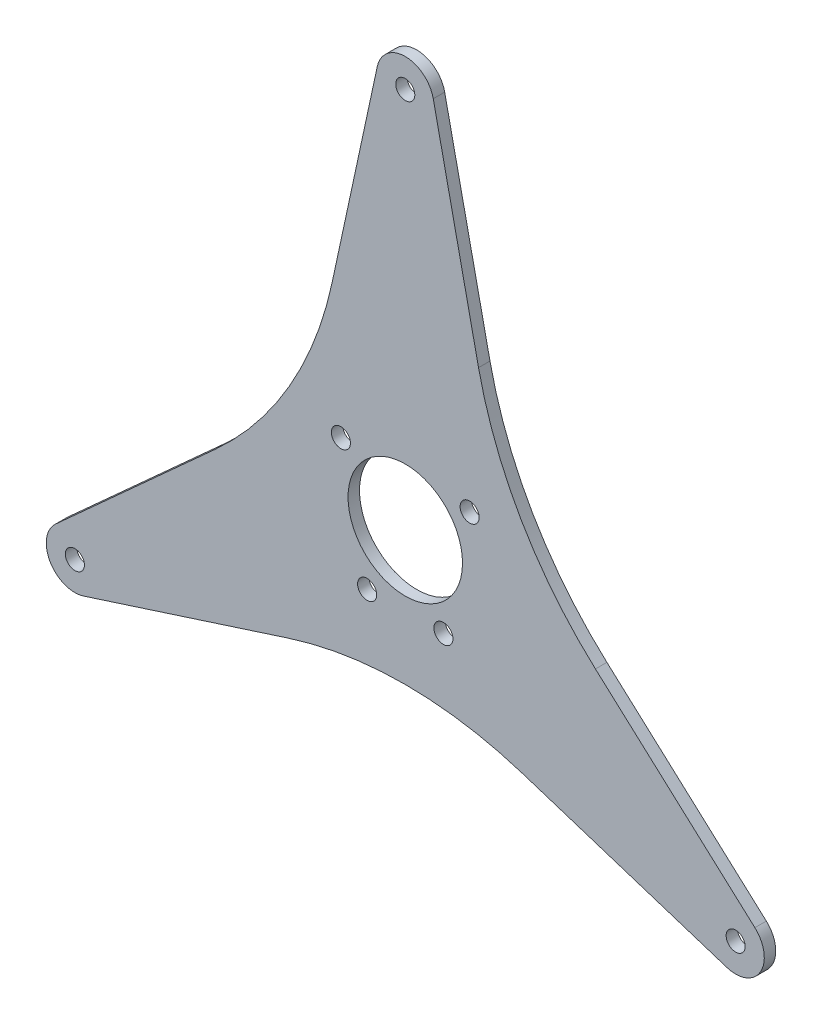
ISO-10303-21;
HEADER;
FILE_DESCRIPTION(('STEP AP214'),'2;1');
FILE_NAME('part.step','',(''),(''),'','','');
FILE_SCHEMA(('AUTOMOTIVE_DESIGN { 1 0 10303 214 1 1 1 1 }'));
ENDSEC;
DATA;
#1=APPLICATION_CONTEXT('core data for automotive mechanical design processes');
#2=APPLICATION_PROTOCOL_DEFINITION('international standard','automotive_design',2000,#1);
#3=PRODUCT_CONTEXT('',#1,'mechanical');
#4=PRODUCT('Part','Part','',(#3));
#5=PRODUCT_RELATED_PRODUCT_CATEGORY('part','',(#4));
#6=PRODUCT_DEFINITION_FORMATION('','',#4);
#7=PRODUCT_DEFINITION_CONTEXT('part definition',#1,'design');
#8=PRODUCT_DEFINITION('design','',#6,#7);
#9=PRODUCT_DEFINITION_SHAPE('','',#8);
#10=(LENGTH_UNIT() NAMED_UNIT(*) SI_UNIT(.MILLI.,.METRE.));
#11=(NAMED_UNIT(*) PLANE_ANGLE_UNIT() SI_UNIT($,.RADIAN.));
#12=(NAMED_UNIT(*) SI_UNIT($,.STERADIAN.) SOLID_ANGLE_UNIT());
#13=UNCERTAINTY_MEASURE_WITH_UNIT(LENGTH_MEASURE(1.E-05),#10,'distance_accuracy_value','');
#14=(GEOMETRIC_REPRESENTATION_CONTEXT(3) GLOBAL_UNCERTAINTY_ASSIGNED_CONTEXT((#13)) GLOBAL_UNIT_ASSIGNED_CONTEXT((#10,
#11,#12)) REPRESENTATION_CONTEXT('',''));
#15=CARTESIAN_POINT('',(0.,0.,0.));
#16=DIRECTION('',(0.,0.,1.));
#17=DIRECTION('',(1.,0.,0.));
#18=AXIS2_PLACEMENT_3D('',#15,#16,#17);
#19=CARTESIAN_POINT('',(-173.205080756888,-100.,6.));
#20=DIRECTION('',(0.,0.,1.));
#21=DIRECTION('',(1.,0.,0.));
#22=AXIS2_PLACEMENT_3D('',#19,#20,#21);
#23=PLANE('',#22);
#24=CARTESIAN_POINT('',(-20.,-36.9323706252388,6.));
#25=DIRECTION('',(0.,0.,1.));
#26=DIRECTION('',(1.,0.,0.));
#27=AXIS2_PLACEMENT_3D('',#24,#25,#26);
#28=CIRCLE('',#27,5.);
#29=CARTESIAN_POINT('',(-15.,-36.9323706252388,6.));
#30=VERTEX_POINT('',#29);
#31=EDGE_CURVE('E309',#30,#30,#28,.T.);
#32=ORIENTED_EDGE('',*,*,#31,.F.);
#33=EDGE_LOOP('',(#32));
#34=FACE_BOUND('',#33,.T.);
#35=CARTESIAN_POINT('',(-33.75,25.0610766091262,6.));
#36=DIRECTION('',(0.,0.,1.));
#37=DIRECTION('',(1.,0.,0.));
#38=AXIS2_PLACEMENT_3D('',#35,#36,#37);
#39=CIRCLE('',#38,5.);
#40=CARTESIAN_POINT('',(-28.75,25.0610766091262,6.));
#41=VERTEX_POINT('',#40);
#42=EDGE_CURVE('E321',#41,#41,#39,.T.);
#43=ORIENTED_EDGE('',*,*,#42,.F.);
#44=EDGE_LOOP('',(#43));
#45=FACE_BOUND('',#44,.T.);
#46=CARTESIAN_POINT('',(173.205080756888,-100.,6.));
#47=DIRECTION('',(0.,0.,1.));
#48=DIRECTION('',(1.,0.,0.));
#49=AXIS2_PLACEMENT_3D('',#46,#47,#48);
#50=CIRCLE('',#49,4.99999999999999);
#51=CARTESIAN_POINT('',(178.205080756888,-100.,6.));
#52=VERTEX_POINT('',#51);
#53=EDGE_CURVE('E333',#52,#52,#50,.T.);
#54=ORIENTED_EDGE('',*,*,#53,.F.);
#55=EDGE_LOOP('',(#54));
#56=FACE_BOUND('',#55,.T.);
#57=CARTESIAN_POINT('',(0.,200.,6.));
#58=DIRECTION('',(0.,0.,1.));
#59=DIRECTION('',(1.,0.,0.));
#60=AXIS2_PLACEMENT_3D('',#57,#58,#59);
#61=CIRCLE('',#60,5.00000000000001);
#62=CARTESIAN_POINT('',(5.0000000000001,200.,6.));
#63=VERTEX_POINT('',#62);
#64=EDGE_CURVE('E160',#63,#63,#61,.T.);
#65=ORIENTED_EDGE('',*,*,#64,.F.);
#66=EDGE_LOOP('',(#65));
#67=FACE_BOUND('',#66,.T.);
#68=CARTESIAN_POINT('',(-173.205080756888,-100.,6.));
#69=DIRECTION('',(0.,0.,1.));
#70=DIRECTION('',(1.,0.,0.));
#71=AXIS2_PLACEMENT_3D('',#68,#69,#70);
#72=CIRCLE('',#71,15.);
#73=CARTESIAN_POINT('',(-183.272280018508,-88.880130440206,6.));
#74=VERTEX_POINT('',#73);
#75=CARTESIAN_POINT('',(-168.608590862147,-114.27838508542,6.));
#76=VERTEX_POINT('',#75);
#77=EDGE_CURVE('E179',#74,#76,#72,.T.);
#78=ORIENTED_EDGE('',*,*,#77,.T.);
#79=DIRECTION('',(0.951892339028003,0.306432659649388,0.));
#80=VECTOR('',#79,1.);
#81=CARTESIAN_POINT('',(-168.608590862147,-114.27838508542,6.));
#82=LINE('',#81,#80);
#83=CARTESIAN_POINT('',(-61.2865319298776,-79.7293267420728,6.));
#84=VERTEX_POINT('',#83);
#85=EDGE_CURVE('E107',#76,#84,#82,.T.);
#86=ORIENTED_EDGE('',*,*,#85,.T.);
#87=CARTESIAN_POINT('',(0.,-270.107794547674,6.));
#88=DIRECTION('',(0.,0.,-1.));
#89=DIRECTION('',(-1.,0.,0.));
#90=AXIS2_PLACEMENT_3D('',#87,#88,#89);
#91=CIRCLE('',#90,200.);
#92=CARTESIAN_POINT('',(61.2865319298776,-79.7293267420729,6.));
#93=VERTEX_POINT('',#92);
#94=EDGE_CURVE('E206',#84,#93,#91,.T.);
#95=ORIENTED_EDGE('',*,*,#94,.T.);
#96=DIRECTION('',(0.951892339028003,-0.306432659649388,0.));
#97=VECTOR('',#96,1.);
#98=CARTESIAN_POINT('',(61.2865319298776,-79.7293267420729,6.));
#99=LINE('',#98,#97);
#100=CARTESIAN_POINT('',(168.608590862147,-114.27838508542,6.));
#101=VERTEX_POINT('',#100);
#102=EDGE_CURVE('E225',#93,#101,#99,.T.);
#103=ORIENTED_EDGE('',*,*,#102,.T.);
#104=CARTESIAN_POINT('',(173.205080756888,-100.,6.));
#105=DIRECTION('',(0.,0.,1.));
#106=DIRECTION('',(1.,0.,0.));
#107=AXIS2_PLACEMENT_3D('',#104,#105,#106);
#108=CIRCLE('',#107,15.);
#109=CARTESIAN_POINT('',(183.272280018508,-88.880130440206,6.));
#110=VERTEX_POINT('',#109);
#111=EDGE_CURVE('E222',#101,#110,#108,.T.);
#112=ORIENTED_EDGE('',*,*,#111,.T.);
#113=DIRECTION('',(-0.741324637319602,0.671146617441346,0.));
#114=VECTOR('',#113,1.);
#115=CARTESIAN_POINT('',(99.690888350204,-13.2110301900838,6.));
#116=LINE('',#115,#114);
#117=CARTESIAN_POINT('',(99.690888350204,-13.2110301900837,6.));
#118=VERTEX_POINT('',#117);
#119=EDGE_CURVE('E224',#110,#118,#116,.T.);
#120=ORIENTED_EDGE('',*,*,#119,.T.);
#121=CARTESIAN_POINT('',(233.920211838473,135.053897273837,6.));
#122=DIRECTION('',(0.,0.,-1.));
#123=DIRECTION('',(1.,0.,0.));
#124=AXIS2_PLACEMENT_3D('',#121,#122,#123);
#125=CIRCLE('',#124,200.);
#126=CARTESIAN_POINT('',(38.4043564203265,92.9403569321565,6.));
#127=VERTEX_POINT('',#126);
#128=EDGE_CURVE('E227',#118,#127,#125,.T.);
#129=ORIENTED_EDGE('',*,*,#128,.T.);
#130=DIRECTION('',(-0.210567701708401,0.977579277090734,0.));
#131=VECTOR('',#130,1.);
#132=CARTESIAN_POINT('',(14.6636891563611,203.158515525626,6.));
#133=LINE('',#132,#131);
#134=CARTESIAN_POINT('',(14.6636891563612,203.158515525626,6.));
#135=VERTEX_POINT('',#134);
#136=EDGE_CURVE('E233',#127,#135,#133,.T.);
#137=ORIENTED_EDGE('',*,*,#136,.T.);
#138=CARTESIAN_POINT('',(0.,200.,6.));
#139=DIRECTION('',(0.,0.,1.));
#140=DIRECTION('',(1.,0.,0.));
#141=AXIS2_PLACEMENT_3D('',#138,#139,#140);
#142=CIRCLE('',#141,15.0000000000001);
#143=CARTESIAN_POINT('',(-14.6636891563611,203.158515525626,6.));
#144=VERTEX_POINT('',#143);
#145=EDGE_CURVE('E138',#135,#144,#142,.T.);
#146=ORIENTED_EDGE('',*,*,#145,.T.);
#147=DIRECTION('',(-0.210567701708401,-0.977579277090734,0.));
#148=VECTOR('',#147,1.);
#149=CARTESIAN_POINT('',(-38.4043564203265,92.9403569321565,6.));
#150=LINE('',#149,#148);
#151=CARTESIAN_POINT('',(-38.4043564203265,92.9403569321564,6.));
#152=VERTEX_POINT('',#151);
#153=EDGE_CURVE('E132',#144,#152,#150,.T.);
#154=ORIENTED_EDGE('',*,*,#153,.T.);
#155=CARTESIAN_POINT('',(-233.920211838473,135.053897273837,6.));
#156=DIRECTION('',(0.,0.,-1.));
#157=DIRECTION('',(1.,0.,0.));
#158=AXIS2_PLACEMENT_3D('',#155,#156,#157);
#159=CIRCLE('',#158,200.);
#160=CARTESIAN_POINT('',(-99.690888350204,-13.2110301900838,6.));
#161=VERTEX_POINT('',#160);
#162=EDGE_CURVE('E136',#152,#161,#159,.T.);
#163=ORIENTED_EDGE('',*,*,#162,.T.);
#164=DIRECTION('',(-0.741324637319602,-0.671146617441346,0.));
#165=VECTOR('',#164,1.);
#166=CARTESIAN_POINT('',(-183.272280018508,-88.880130440206,6.));
#167=LINE('',#166,#165);
#168=EDGE_CURVE('E52',#161,#74,#167,.T.);
#169=ORIENTED_EDGE('',*,*,#168,.T.);
#170=EDGE_LOOP('',(#78,#86,#95,#103,#112,#120,#129,#137,#146,#154,#163,#169));
#171=FACE_BOUND('',#170,.T.);
#172=CARTESIAN_POINT('',(0.,0.,6.));
#173=DIRECTION('',(0.,0.,1.));
#174=DIRECTION('',(1.,0.,0.));
#175=AXIS2_PLACEMENT_3D('',#172,#173,#174);
#176=CIRCLE('',#175,30.);
#177=CARTESIAN_POINT('',(30.,0.,6.));
#178=VERTEX_POINT('',#177);
#179=EDGE_CURVE('E339',#178,#178,#176,.T.);
#180=ORIENTED_EDGE('',*,*,#179,.F.);
#181=EDGE_LOOP('',(#180));
#182=FACE_BOUND('',#181,.T.);
#183=CARTESIAN_POINT('',(-173.205080756888,-100.,6.));
#184=DIRECTION('',(0.,0.,1.));
#185=DIRECTION('',(1.,0.,0.));
#186=AXIS2_PLACEMENT_3D('',#183,#184,#185);
#187=CIRCLE('',#186,5.00000000000002);
#188=CARTESIAN_POINT('',(-168.205080756888,-100.,6.));
#189=VERTEX_POINT('',#188);
#190=EDGE_CURVE('E327',#189,#189,#187,.T.);
#191=ORIENTED_EDGE('',*,*,#190,.F.);
#192=EDGE_LOOP('',(#191));
#193=FACE_BOUND('',#192,.T.);
#194=CARTESIAN_POINT('',(33.75,25.0610766091262,6.));
#195=DIRECTION('',(0.,0.,1.));
#196=DIRECTION('',(1.,0.,0.));
#197=AXIS2_PLACEMENT_3D('',#194,#195,#196);
#198=CIRCLE('',#197,4.99999999999999);
#199=CARTESIAN_POINT('',(38.75,25.0610766091262,6.));
#200=VERTEX_POINT('',#199);
#201=EDGE_CURVE('E315',#200,#200,#198,.T.);
#202=ORIENTED_EDGE('',*,*,#201,.F.);
#203=EDGE_LOOP('',(#202));
#204=FACE_BOUND('',#203,.T.);
#205=CARTESIAN_POINT('',(20.,-36.9323706252388,6.));
#206=DIRECTION('',(0.,0.,1.));
#207=DIRECTION('',(1.,0.,0.));
#208=AXIS2_PLACEMENT_3D('',#205,#206,#207);
#209=CIRCLE('',#208,5.);
#210=CARTESIAN_POINT('',(25.,-36.9323706252388,6.));
#211=VERTEX_POINT('',#210);
#212=EDGE_CURVE('E300',#211,#211,#209,.T.);
#213=ORIENTED_EDGE('',*,*,#212,.F.);
#214=EDGE_LOOP('',(#213));
#215=FACE_BOUND('',#214,.T.);
#216=ADVANCED_FACE('F35',(#34,#45,#56,#67,#171,#182,#193,#204,#215),#23,.T.);
#217=CARTESIAN_POINT('',(-173.205080756888,-100.,0.));
#218=DIRECTION('',(0.,0.,1.));
#219=DIRECTION('',(1.,0.,0.));
#220=AXIS2_PLACEMENT_3D('',#217,#218,#219);
#221=PLANE('',#220);
#222=CARTESIAN_POINT('',(-173.205080756888,-100.,0.));
#223=DIRECTION('',(0.,0.,1.));
#224=DIRECTION('',(1.,0.,0.));
#225=AXIS2_PLACEMENT_3D('',#222,#223,#224);
#226=CIRCLE('',#225,15.);
#227=CARTESIAN_POINT('',(-183.272280018508,-88.880130440206,0.));
#228=VERTEX_POINT('',#227);
#229=CARTESIAN_POINT('',(-168.608590862147,-114.27838508542,0.));
#230=VERTEX_POINT('',#229);
#231=EDGE_CURVE('E156',#228,#230,#226,.T.);
#232=ORIENTED_EDGE('',*,*,#231,.F.);
#233=DIRECTION('',(-0.741324637319602,-0.671146617441346,0.));
#234=VECTOR('',#233,1.);
#235=CARTESIAN_POINT('',(-183.272280018508,-88.880130440206,0.));
#236=LINE('',#235,#234);
#237=CARTESIAN_POINT('',(-99.690888350204,-13.2110301900838,0.));
#238=VERTEX_POINT('',#237);
#239=EDGE_CURVE('E99',#238,#228,#236,.T.);
#240=ORIENTED_EDGE('',*,*,#239,.F.);
#241=CARTESIAN_POINT('',(-233.920211838473,135.053897273837,0.));
#242=DIRECTION('',(0.,0.,-1.));
#243=DIRECTION('',(1.,0.,0.));
#244=AXIS2_PLACEMENT_3D('',#241,#242,#243);
#245=CIRCLE('',#244,200.);
#246=CARTESIAN_POINT('',(-38.4043564203265,92.9403569321564,0.));
#247=VERTEX_POINT('',#246);
#248=EDGE_CURVE('E93',#247,#238,#245,.T.);
#249=ORIENTED_EDGE('',*,*,#248,.F.);
#250=DIRECTION('',(-0.210567701708401,-0.977579277090734,0.));
#251=VECTOR('',#250,1.);
#252=CARTESIAN_POINT('',(-38.4043564203265,92.9403569321565,0.));
#253=LINE('',#252,#251);
#254=CARTESIAN_POINT('',(-14.6636891563611,203.158515525626,0.));
#255=VERTEX_POINT('',#254);
#256=EDGE_CURVE('E146',#255,#247,#253,.T.);
#257=ORIENTED_EDGE('',*,*,#256,.F.);
#258=CARTESIAN_POINT('',(0.,200.,0.));
#259=DIRECTION('',(0.,0.,1.));
#260=DIRECTION('',(1.,0.,0.));
#261=AXIS2_PLACEMENT_3D('',#258,#259,#260);
#262=CIRCLE('',#261,15.0000000000001);
#263=CARTESIAN_POINT('',(14.6636891563612,203.158515525626,0.));
#264=VERTEX_POINT('',#263);
#265=EDGE_CURVE('E174',#264,#255,#262,.T.);
#266=ORIENTED_EDGE('',*,*,#265,.F.);
#267=DIRECTION('',(-0.210567701708401,0.977579277090734,0.));
#268=VECTOR('',#267,1.);
#269=CARTESIAN_POINT('',(14.6636891563611,203.158515525626,0.));
#270=LINE('',#269,#268);
#271=CARTESIAN_POINT('',(38.4043564203265,92.9403569321565,0.));
#272=VERTEX_POINT('',#271);
#273=EDGE_CURVE('E172',#272,#264,#270,.T.);
#274=ORIENTED_EDGE('',*,*,#273,.F.);
#275=CARTESIAN_POINT('',(233.920211838473,135.053897273837,0.));
#276=DIRECTION('',(0.,0.,-1.));
#277=DIRECTION('',(1.,0.,0.));
#278=AXIS2_PLACEMENT_3D('',#275,#276,#277);
#279=CIRCLE('',#278,200.);
#280=CARTESIAN_POINT('',(99.690888350204,-13.2110301900837,0.));
#281=VERTEX_POINT('',#280);
#282=EDGE_CURVE('E170',#281,#272,#279,.T.);
#283=ORIENTED_EDGE('',*,*,#282,.F.);
#284=DIRECTION('',(-0.741324637319602,0.671146617441346,0.));
#285=VECTOR('',#284,1.);
#286=CARTESIAN_POINT('',(99.690888350204,-13.2110301900838,0.));
#287=LINE('',#286,#285);
#288=CARTESIAN_POINT('',(183.272280018508,-88.880130440206,0.));
#289=VERTEX_POINT('',#288);
#290=EDGE_CURVE('E168',#289,#281,#287,.T.);
#291=ORIENTED_EDGE('',*,*,#290,.F.);
#292=CARTESIAN_POINT('',(173.205080756888,-100.,0.));
#293=DIRECTION('',(0.,0.,1.));
#294=DIRECTION('',(1.,0.,0.));
#295=AXIS2_PLACEMENT_3D('',#292,#293,#294);
#296=CIRCLE('',#295,15.);
#297=CARTESIAN_POINT('',(168.608590862147,-114.27838508542,0.));
#298=VERTEX_POINT('',#297);
#299=EDGE_CURVE('E166',#298,#289,#296,.T.);
#300=ORIENTED_EDGE('',*,*,#299,.F.);
#301=DIRECTION('',(0.951892339028003,-0.306432659649388,0.));
#302=VECTOR('',#301,1.);
#303=CARTESIAN_POINT('',(61.2865319298776,-79.7293267420729,0.));
#304=LINE('',#303,#302);
#305=CARTESIAN_POINT('',(61.2865319298776,-79.7293267420729,0.));
#306=VERTEX_POINT('',#305);
#307=EDGE_CURVE('E164',#306,#298,#304,.T.);
#308=ORIENTED_EDGE('',*,*,#307,.F.);
#309=CARTESIAN_POINT('',(0.,-270.107794547674,0.));
#310=DIRECTION('',(0.,0.,-1.));
#311=DIRECTION('',(-1.,0.,0.));
#312=AXIS2_PLACEMENT_3D('',#309,#310,#311);
#313=CIRCLE('',#312,200.);
#314=CARTESIAN_POINT('',(-61.2865319298776,-79.7293267420728,0.));
#315=VERTEX_POINT('',#314);
#316=EDGE_CURVE('E162',#315,#306,#313,.T.);
#317=ORIENTED_EDGE('',*,*,#316,.F.);
#318=DIRECTION('',(0.951892339028003,0.306432659649388,0.));
#319=VECTOR('',#318,1.);
#320=CARTESIAN_POINT('',(-168.608590862147,-114.27838508542,0.));
#321=LINE('',#320,#319);
#322=EDGE_CURVE('E159',#230,#315,#321,.T.);
#323=ORIENTED_EDGE('',*,*,#322,.F.);
#324=EDGE_LOOP('',(#232,#240,#249,#257,#266,#274,#283,#291,#300,#308,#317,#323));
#325=FACE_BOUND('',#324,.T.);
#326=CARTESIAN_POINT('',(0.,200.,0.));
#327=DIRECTION('',(0.,0.,1.));
#328=DIRECTION('',(1.,0.,0.));
#329=AXIS2_PLACEMENT_3D('',#326,#327,#328);
#330=CIRCLE('',#329,5.00000000000001);
#331=CARTESIAN_POINT('',(5.0000000000001,200.,0.));
#332=VERTEX_POINT('',#331);
#333=EDGE_CURVE('E342',#332,#332,#330,.T.);
#334=ORIENTED_EDGE('',*,*,#333,.T.);
#335=EDGE_LOOP('',(#334));
#336=FACE_BOUND('',#335,.T.);
#337=CARTESIAN_POINT('',(0.,0.,0.));
#338=DIRECTION('',(0.,0.,1.));
#339=DIRECTION('',(1.,0.,0.));
#340=AXIS2_PLACEMENT_3D('',#337,#338,#339);
#341=CIRCLE('',#340,30.);
#342=CARTESIAN_POINT('',(30.,0.,0.));
#343=VERTEX_POINT('',#342);
#344=EDGE_CURVE('E336',#343,#343,#341,.T.);
#345=ORIENTED_EDGE('',*,*,#344,.T.);
#346=EDGE_LOOP('',(#345));
#347=FACE_BOUND('',#346,.T.);
#348=CARTESIAN_POINT('',(173.205080756888,-100.,0.));
#349=DIRECTION('',(0.,0.,1.));
#350=DIRECTION('',(1.,0.,0.));
#351=AXIS2_PLACEMENT_3D('',#348,#349,#350);
#352=CIRCLE('',#351,4.99999999999999);
#353=CARTESIAN_POINT('',(178.205080756888,-100.,0.));
#354=VERTEX_POINT('',#353);
#355=EDGE_CURVE('E330',#354,#354,#352,.T.);
#356=ORIENTED_EDGE('',*,*,#355,.T.);
#357=EDGE_LOOP('',(#356));
#358=FACE_BOUND('',#357,.T.);
#359=CARTESIAN_POINT('',(-173.205080756888,-100.,0.));
#360=DIRECTION('',(0.,0.,1.));
#361=DIRECTION('',(1.,0.,0.));
#362=AXIS2_PLACEMENT_3D('',#359,#360,#361);
#363=CIRCLE('',#362,5.00000000000002);
#364=CARTESIAN_POINT('',(-168.205080756888,-100.,0.));
#365=VERTEX_POINT('',#364);
#366=EDGE_CURVE('E324',#365,#365,#363,.T.);
#367=ORIENTED_EDGE('',*,*,#366,.T.);
#368=EDGE_LOOP('',(#367));
#369=FACE_BOUND('',#368,.T.);
#370=CARTESIAN_POINT('',(-33.75,25.0610766091262,0.));
#371=DIRECTION('',(0.,0.,1.));
#372=DIRECTION('',(1.,0.,0.));
#373=AXIS2_PLACEMENT_3D('',#370,#371,#372);
#374=CIRCLE('',#373,5.);
#375=CARTESIAN_POINT('',(-28.75,25.0610766091262,0.));
#376=VERTEX_POINT('',#375);
#377=EDGE_CURVE('E318',#376,#376,#374,.T.);
#378=ORIENTED_EDGE('',*,*,#377,.T.);
#379=EDGE_LOOP('',(#378));
#380=FACE_BOUND('',#379,.T.);
#381=CARTESIAN_POINT('',(33.75,25.0610766091262,0.));
#382=DIRECTION('',(0.,0.,1.));
#383=DIRECTION('',(1.,0.,0.));
#384=AXIS2_PLACEMENT_3D('',#381,#382,#383);
#385=CIRCLE('',#384,4.99999999999999);
#386=CARTESIAN_POINT('',(38.75,25.0610766091262,0.));
#387=VERTEX_POINT('',#386);
#388=EDGE_CURVE('E312',#387,#387,#385,.T.);
#389=ORIENTED_EDGE('',*,*,#388,.T.);
#390=EDGE_LOOP('',(#389));
#391=FACE_BOUND('',#390,.T.);
#392=CARTESIAN_POINT('',(-20.,-36.9323706252388,0.));
#393=DIRECTION('',(0.,0.,1.));
#394=DIRECTION('',(1.,0.,0.));
#395=AXIS2_PLACEMENT_3D('',#392,#393,#394);
#396=CIRCLE('',#395,5.);
#397=CARTESIAN_POINT('',(-15.,-36.9323706252388,0.));
#398=VERTEX_POINT('',#397);
#399=EDGE_CURVE('E306',#398,#398,#396,.T.);
#400=ORIENTED_EDGE('',*,*,#399,.T.);
#401=EDGE_LOOP('',(#400));
#402=FACE_BOUND('',#401,.T.);
#403=CARTESIAN_POINT('',(20.,-36.9323706252388,0.));
#404=DIRECTION('',(0.,0.,1.));
#405=DIRECTION('',(1.,0.,0.));
#406=AXIS2_PLACEMENT_3D('',#403,#404,#405);
#407=CIRCLE('',#406,5.);
#408=CARTESIAN_POINT('',(25.,-36.9323706252388,0.));
#409=VERTEX_POINT('',#408);
#410=EDGE_CURVE('E303',#409,#409,#407,.T.);
#411=ORIENTED_EDGE('',*,*,#410,.T.);
#412=EDGE_LOOP('',(#411));
#413=FACE_BOUND('',#412,.T.);
#414=ADVANCED_FACE('F210',(#325,#336,#347,#358,#369,#380,#391,#402,#413),#221,.F.);
#415=CARTESIAN_POINT('',(-173.205080756888,-100.,6.));
#416=DIRECTION('',(0.,0.,-1.));
#417=DIRECTION('',(-1.,0.,0.));
#418=AXIS2_PLACEMENT_3D('',#415,#416,#417);
#419=CYLINDRICAL_SURFACE('',#418,15.);
#420=ORIENTED_EDGE('',*,*,#231,.T.);
#421=DIRECTION('',(0.,0.,-1.));
#422=VECTOR('',#421,1.);
#423=CARTESIAN_POINT('',(-168.608590862147,-114.27838508542,6.));
#424=LINE('',#423,#422);
#425=EDGE_CURVE('E11',#76,#230,#424,.T.);
#426=ORIENTED_EDGE('',*,*,#425,.F.);
#427=ORIENTED_EDGE('',*,*,#77,.F.);
#428=DIRECTION('',(0.,0.,-1.));
#429=VECTOR('',#428,1.);
#430=CARTESIAN_POINT('',(-183.272280018508,-88.880130440206,6.));
#431=LINE('',#430,#429);
#432=EDGE_CURVE('E152',#74,#228,#431,.T.);
#433=ORIENTED_EDGE('',*,*,#432,.T.);
#434=EDGE_LOOP('',(#420,#426,#427,#433));
#435=FACE_BOUND('',#434,.T.);
#436=ADVANCED_FACE('F37',(#435),#419,.T.);
#437=CARTESIAN_POINT('',(-168.608590862147,-114.27838508542,6.));
#438=DIRECTION('',(-0.306432659649388,0.951892339028003,0.));
#439=DIRECTION('',(-0.951892339028003,-0.306432659649388,0.));
#440=AXIS2_PLACEMENT_3D('',#437,#438,#439);
#441=PLANE('',#440);
#442=ORIENTED_EDGE('',*,*,#322,.T.);
#443=DIRECTION('',(0.,0.,-1.));
#444=VECTOR('',#443,1.);
#445=CARTESIAN_POINT('',(-61.2865319298776,-79.7293267420728,6.));
#446=LINE('',#445,#444);
#447=EDGE_CURVE('E44',#84,#315,#446,.T.);
#448=ORIENTED_EDGE('',*,*,#447,.F.);
#449=ORIENTED_EDGE('',*,*,#85,.F.);
#450=ORIENTED_EDGE('',*,*,#425,.T.);
#451=EDGE_LOOP('',(#442,#448,#449,#450));
#452=FACE_BOUND('',#451,.T.);
#453=ADVANCED_FACE('F488',(#452),#441,.F.);
#454=CARTESIAN_POINT('',(0.,-270.107794547674,6.));
#455=DIRECTION('',(0.,0.,-1.));
#456=DIRECTION('',(-1.,0.,0.));
#457=AXIS2_PLACEMENT_3D('',#454,#455,#456);
#458=CYLINDRICAL_SURFACE('',#457,200.);
#459=ORIENTED_EDGE('',*,*,#316,.T.);
#460=DIRECTION('',(0.,0.,-1.));
#461=VECTOR('',#460,1.);
#462=CARTESIAN_POINT('',(61.2865319298776,-79.7293267420729,6.));
#463=LINE('',#462,#461);
#464=EDGE_CURVE('E198',#93,#306,#463,.T.);
#465=ORIENTED_EDGE('',*,*,#464,.F.);
#466=ORIENTED_EDGE('',*,*,#94,.F.);
#467=ORIENTED_EDGE('',*,*,#447,.T.);
#468=EDGE_LOOP('',(#459,#465,#466,#467));
#469=FACE_BOUND('',#468,.T.);
#470=ADVANCED_FACE('F204',(#469),#458,.F.);
#471=CARTESIAN_POINT('',(61.2865319298776,-79.7293267420729,6.));
#472=DIRECTION('',(0.306432659649388,0.951892339028003,0.));
#473=DIRECTION('',(-0.951892339028003,0.306432659649388,0.));
#474=AXIS2_PLACEMENT_3D('',#471,#472,#473);
#475=PLANE('',#474);
#476=ORIENTED_EDGE('',*,*,#307,.T.);
#477=DIRECTION('',(0.,0.,-1.));
#478=VECTOR('',#477,1.);
#479=CARTESIAN_POINT('',(168.608590862147,-114.27838508542,6.));
#480=LINE('',#479,#478);
#481=EDGE_CURVE('E195',#101,#298,#480,.T.);
#482=ORIENTED_EDGE('',*,*,#481,.F.);
#483=ORIENTED_EDGE('',*,*,#102,.F.);
#484=ORIENTED_EDGE('',*,*,#464,.T.);
#485=EDGE_LOOP('',(#476,#482,#483,#484));
#486=FACE_BOUND('',#485,.T.);
#487=ADVANCED_FACE('F216',(#486),#475,.F.);
#488=CARTESIAN_POINT('',(173.205080756888,-100.,6.));
#489=DIRECTION('',(0.,0.,-1.));
#490=DIRECTION('',(-1.,0.,0.));
#491=AXIS2_PLACEMENT_3D('',#488,#489,#490);
#492=CYLINDRICAL_SURFACE('',#491,15.);
#493=ORIENTED_EDGE('',*,*,#299,.T.);
#494=DIRECTION('',(0.,0.,-1.));
#495=VECTOR('',#494,1.);
#496=CARTESIAN_POINT('',(183.272280018508,-88.880130440206,6.));
#497=LINE('',#496,#495);
#498=EDGE_CURVE('E192',#110,#289,#497,.T.);
#499=ORIENTED_EDGE('',*,*,#498,.F.);
#500=ORIENTED_EDGE('',*,*,#111,.F.);
#501=ORIENTED_EDGE('',*,*,#481,.T.);
#502=EDGE_LOOP('',(#493,#499,#500,#501));
#503=FACE_BOUND('',#502,.T.);
#504=ADVANCED_FACE('F220',(#503),#492,.T.);
#505=CARTESIAN_POINT('',(99.690888350204,-13.2110301900838,6.));
#506=DIRECTION('',(-0.671146617441346,-0.741324637319602,0.));
#507=DIRECTION('',(0.741324637319602,-0.671146617441346,0.));
#508=AXIS2_PLACEMENT_3D('',#505,#506,#507);
#509=PLANE('',#508);
#510=ORIENTED_EDGE('',*,*,#290,.T.);
#511=DIRECTION('',(0.,0.,-1.));
#512=VECTOR('',#511,1.);
#513=CARTESIAN_POINT('',(99.690888350204,-13.2110301900837,6.));
#514=LINE('',#513,#512);
#515=EDGE_CURVE('E189',#118,#281,#514,.T.);
#516=ORIENTED_EDGE('',*,*,#515,.F.);
#517=ORIENTED_EDGE('',*,*,#119,.F.);
#518=ORIENTED_EDGE('',*,*,#498,.T.);
#519=EDGE_LOOP('',(#510,#516,#517,#518));
#520=FACE_BOUND('',#519,.T.);
#521=ADVANCED_FACE('F453',(#520),#509,.F.);
#522=CARTESIAN_POINT('',(233.920211838473,135.053897273837,6.));
#523=DIRECTION('',(0.,0.,-1.));
#524=DIRECTION('',(-1.,0.,0.));
#525=AXIS2_PLACEMENT_3D('',#522,#523,#524);
#526=CYLINDRICAL_SURFACE('',#525,200.);
#527=ORIENTED_EDGE('',*,*,#282,.T.);
#528=DIRECTION('',(0.,0.,-1.));
#529=VECTOR('',#528,1.);
#530=CARTESIAN_POINT('',(38.4043564203265,92.9403569321565,6.));
#531=LINE('',#530,#529);
#532=EDGE_CURVE('E186',#127,#272,#531,.T.);
#533=ORIENTED_EDGE('',*,*,#532,.F.);
#534=ORIENTED_EDGE('',*,*,#128,.F.);
#535=ORIENTED_EDGE('',*,*,#515,.T.);
#536=EDGE_LOOP('',(#527,#533,#534,#535));
#537=FACE_BOUND('',#536,.T.);
#538=ADVANCED_FACE('F444',(#537),#526,.F.);
#539=CARTESIAN_POINT('',(14.6636891563611,203.158515525626,6.));
#540=DIRECTION('',(-0.977579277090734,-0.210567701708401,0.));
#541=DIRECTION('',(0.210567701708401,-0.977579277090734,0.));
#542=AXIS2_PLACEMENT_3D('',#539,#540,#541);
#543=PLANE('',#542);
#544=ORIENTED_EDGE('',*,*,#273,.T.);
#545=DIRECTION('',(0.,0.,-1.));
#546=VECTOR('',#545,1.);
#547=CARTESIAN_POINT('',(14.6636891563612,203.158515525626,6.));
#548=LINE('',#547,#546);
#549=EDGE_CURVE('E183',#135,#264,#548,.T.);
#550=ORIENTED_EDGE('',*,*,#549,.F.);
#551=ORIENTED_EDGE('',*,*,#136,.F.);
#552=ORIENTED_EDGE('',*,*,#532,.T.);
#553=EDGE_LOOP('',(#544,#550,#551,#552));
#554=FACE_BOUND('',#553,.T.);
#555=ADVANCED_FACE('F239',(#554),#543,.F.);
#556=CARTESIAN_POINT('',(0.,200.,6.));
#557=DIRECTION('',(0.,0.,-1.));
#558=DIRECTION('',(-1.,0.,0.));
#559=AXIS2_PLACEMENT_3D('',#556,#557,#558);
#560=CYLINDRICAL_SURFACE('',#559,15.0000000000001);
#561=ORIENTED_EDGE('',*,*,#265,.T.);
#562=DIRECTION('',(0.,0.,-1.));
#563=VECTOR('',#562,1.);
#564=CARTESIAN_POINT('',(-14.6636891563611,203.158515525626,6.));
#565=LINE('',#564,#563);
#566=EDGE_CURVE('E147',#144,#255,#565,.T.);
#567=ORIENTED_EDGE('',*,*,#566,.F.);
#568=ORIENTED_EDGE('',*,*,#145,.F.);
#569=ORIENTED_EDGE('',*,*,#549,.T.);
#570=EDGE_LOOP('',(#561,#567,#568,#569));
#571=FACE_BOUND('',#570,.T.);
#572=ADVANCED_FACE('F243',(#571),#560,.T.);
#573=CARTESIAN_POINT('',(-38.4043564203265,92.9403569321565,6.));
#574=DIRECTION('',(0.977579277090734,-0.210567701708401,0.));
#575=DIRECTION('',(0.210567701708401,0.977579277090734,0.));
#576=AXIS2_PLACEMENT_3D('',#573,#574,#575);
#577=PLANE('',#576);
#578=ORIENTED_EDGE('',*,*,#256,.T.);
#579=DIRECTION('',(0.,0.,-1.));
#580=VECTOR('',#579,1.);
#581=CARTESIAN_POINT('',(-38.4043564203265,92.9403569321564,6.));
#582=LINE('',#581,#580);
#583=EDGE_CURVE('E143',#152,#247,#582,.T.);
#584=ORIENTED_EDGE('',*,*,#583,.F.);
#585=ORIENTED_EDGE('',*,*,#153,.F.);
#586=ORIENTED_EDGE('',*,*,#566,.T.);
#587=EDGE_LOOP('',(#578,#584,#585,#586));
#588=FACE_BOUND('',#587,.T.);
#589=ADVANCED_FACE('F144',(#588),#577,.F.);
#590=CARTESIAN_POINT('',(-233.920211838473,135.053897273837,6.));
#591=DIRECTION('',(0.,0.,-1.));
#592=DIRECTION('',(-1.,0.,0.));
#593=AXIS2_PLACEMENT_3D('',#590,#591,#592);
#594=CYLINDRICAL_SURFACE('',#593,200.);
#595=ORIENTED_EDGE('',*,*,#248,.T.);
#596=DIRECTION('',(0.,0.,-1.));
#597=VECTOR('',#596,1.);
#598=CARTESIAN_POINT('',(-99.690888350204,-13.2110301900838,6.));
#599=LINE('',#598,#597);
#600=EDGE_CURVE('E148',#161,#238,#599,.T.);
#601=ORIENTED_EDGE('',*,*,#600,.F.);
#602=ORIENTED_EDGE('',*,*,#162,.F.);
#603=ORIENTED_EDGE('',*,*,#583,.T.);
#604=EDGE_LOOP('',(#595,#601,#602,#603));
#605=FACE_BOUND('',#604,.T.);
#606=ADVANCED_FACE('F150',(#605),#594,.F.);
#607=CARTESIAN_POINT('',(-183.272280018508,-88.880130440206,6.));
#608=DIRECTION('',(0.671146617441346,-0.741324637319602,0.));
#609=DIRECTION('',(0.741324637319602,0.671146617441346,0.));
#610=AXIS2_PLACEMENT_3D('',#607,#608,#609);
#611=PLANE('',#610);
#612=ORIENTED_EDGE('',*,*,#239,.T.);
#613=ORIENTED_EDGE('',*,*,#432,.F.);
#614=ORIENTED_EDGE('',*,*,#168,.F.);
#615=ORIENTED_EDGE('',*,*,#600,.T.);
#616=EDGE_LOOP('',(#612,#613,#614,#615));
#617=FACE_BOUND('',#616,.T.);
#618=ADVANCED_FACE('F247',(#617),#611,.F.);
#619=CARTESIAN_POINT('',(0.,200.,6.));
#620=DIRECTION('',(0.,0.,-1.));
#621=DIRECTION('',(-1.,0.,0.));
#622=AXIS2_PLACEMENT_3D('',#619,#620,#621);
#623=CYLINDRICAL_SURFACE('',#622,5.00000000000001);
#624=ORIENTED_EDGE('',*,*,#64,.T.);
#625=EDGE_LOOP('',(#624));
#626=FACE_BOUND('',#625,.T.);
#627=ORIENTED_EDGE('',*,*,#333,.F.);
#628=EDGE_LOOP('',(#627));
#629=FACE_BOUND('',#628,.T.);
#630=ADVANCED_FACE('F249',(#626,#629),#623,.F.);
#631=CARTESIAN_POINT('',(0.,0.,6.));
#632=DIRECTION('',(0.,0.,-1.));
#633=DIRECTION('',(-1.,0.,0.));
#634=AXIS2_PLACEMENT_3D('',#631,#632,#633);
#635=CYLINDRICAL_SURFACE('',#634,30.);
#636=ORIENTED_EDGE('',*,*,#179,.T.);
#637=EDGE_LOOP('',(#636));
#638=FACE_BOUND('',#637,.T.);
#639=ORIENTED_EDGE('',*,*,#344,.F.);
#640=EDGE_LOOP('',(#639));
#641=FACE_BOUND('',#640,.T.);
#642=ADVANCED_FACE('F255',(#638,#641),#635,.F.);
#643=CARTESIAN_POINT('',(173.205080756888,-100.,6.));
#644=DIRECTION('',(0.,0.,-1.));
#645=DIRECTION('',(-1.,0.,0.));
#646=AXIS2_PLACEMENT_3D('',#643,#644,#645);
#647=CYLINDRICAL_SURFACE('',#646,4.99999999999999);
#648=ORIENTED_EDGE('',*,*,#53,.T.);
#649=EDGE_LOOP('',(#648));
#650=FACE_BOUND('',#649,.T.);
#651=ORIENTED_EDGE('',*,*,#355,.F.);
#652=EDGE_LOOP('',(#651));
#653=FACE_BOUND('',#652,.T.);
#654=ADVANCED_FACE('F271',(#650,#653),#647,.F.);
#655=CARTESIAN_POINT('',(-173.205080756888,-100.,6.));
#656=DIRECTION('',(0.,0.,-1.));
#657=DIRECTION('',(-1.,0.,0.));
#658=AXIS2_PLACEMENT_3D('',#655,#656,#657);
#659=CYLINDRICAL_SURFACE('',#658,5.00000000000002);
#660=ORIENTED_EDGE('',*,*,#190,.T.);
#661=EDGE_LOOP('',(#660));
#662=FACE_BOUND('',#661,.T.);
#663=ORIENTED_EDGE('',*,*,#366,.F.);
#664=EDGE_LOOP('',(#663));
#665=FACE_BOUND('',#664,.T.);
#666=ADVANCED_FACE('F275',(#662,#665),#659,.F.);
#667=CARTESIAN_POINT('',(-33.75,25.0610766091262,6.));
#668=DIRECTION('',(0.,0.,-1.));
#669=DIRECTION('',(-1.,0.,0.));
#670=AXIS2_PLACEMENT_3D('',#667,#668,#669);
#671=CYLINDRICAL_SURFACE('',#670,5.);
#672=ORIENTED_EDGE('',*,*,#42,.T.);
#673=EDGE_LOOP('',(#672));
#674=FACE_BOUND('',#673,.T.);
#675=ORIENTED_EDGE('',*,*,#377,.F.);
#676=EDGE_LOOP('',(#675));
#677=FACE_BOUND('',#676,.T.);
#678=ADVANCED_FACE('F279',(#674,#677),#671,.F.);
#679=CARTESIAN_POINT('',(33.75,25.0610766091262,6.));
#680=DIRECTION('',(0.,0.,-1.));
#681=DIRECTION('',(-1.,0.,0.));
#682=AXIS2_PLACEMENT_3D('',#679,#680,#681);
#683=CYLINDRICAL_SURFACE('',#682,4.99999999999999);
#684=ORIENTED_EDGE('',*,*,#201,.T.);
#685=EDGE_LOOP('',(#684));
#686=FACE_BOUND('',#685,.T.);
#687=ORIENTED_EDGE('',*,*,#388,.F.);
#688=EDGE_LOOP('',(#687));
#689=FACE_BOUND('',#688,.T.);
#690=ADVANCED_FACE('F283',(#686,#689),#683,.F.);
#691=CARTESIAN_POINT('',(-20.,-36.9323706252388,6.));
#692=DIRECTION('',(0.,0.,-1.));
#693=DIRECTION('',(-1.,0.,0.));
#694=AXIS2_PLACEMENT_3D('',#691,#692,#693);
#695=CYLINDRICAL_SURFACE('',#694,5.);
#696=ORIENTED_EDGE('',*,*,#31,.T.);
#697=EDGE_LOOP('',(#696));
#698=FACE_BOUND('',#697,.T.);
#699=ORIENTED_EDGE('',*,*,#399,.F.);
#700=EDGE_LOOP('',(#699));
#701=FACE_BOUND('',#700,.T.);
#702=ADVANCED_FACE('F287',(#698,#701),#695,.F.);
#703=CARTESIAN_POINT('',(20.,-36.9323706252388,6.));
#704=DIRECTION('',(0.,0.,-1.));
#705=DIRECTION('',(-1.,0.,0.));
#706=AXIS2_PLACEMENT_3D('',#703,#704,#705);
#707=CYLINDRICAL_SURFACE('',#706,5.);
#708=ORIENTED_EDGE('',*,*,#212,.T.);
#709=EDGE_LOOP('',(#708));
#710=FACE_BOUND('',#709,.T.);
#711=ORIENTED_EDGE('',*,*,#410,.F.);
#712=EDGE_LOOP('',(#711));
#713=FACE_BOUND('',#712,.T.);
#714=ADVANCED_FACE('F291',(#710,#713),#707,.F.);
#715=CLOSED_SHELL('',(#216,#414,#436,#453,#470,#487,#504,#521,#538,#555,#572,#589,#606,#618,
#630,#642,#654,#666,#678,#690,#702,#714));
#716=MANIFOLD_SOLID_BREP('B2',#715);
#717=ADVANCED_BREP_SHAPE_REPRESENTATION('',(#18,#716),#14);
#718=SHAPE_DEFINITION_REPRESENTATION(#9,#717);
ENDSEC;
END-ISO-10303-21;
